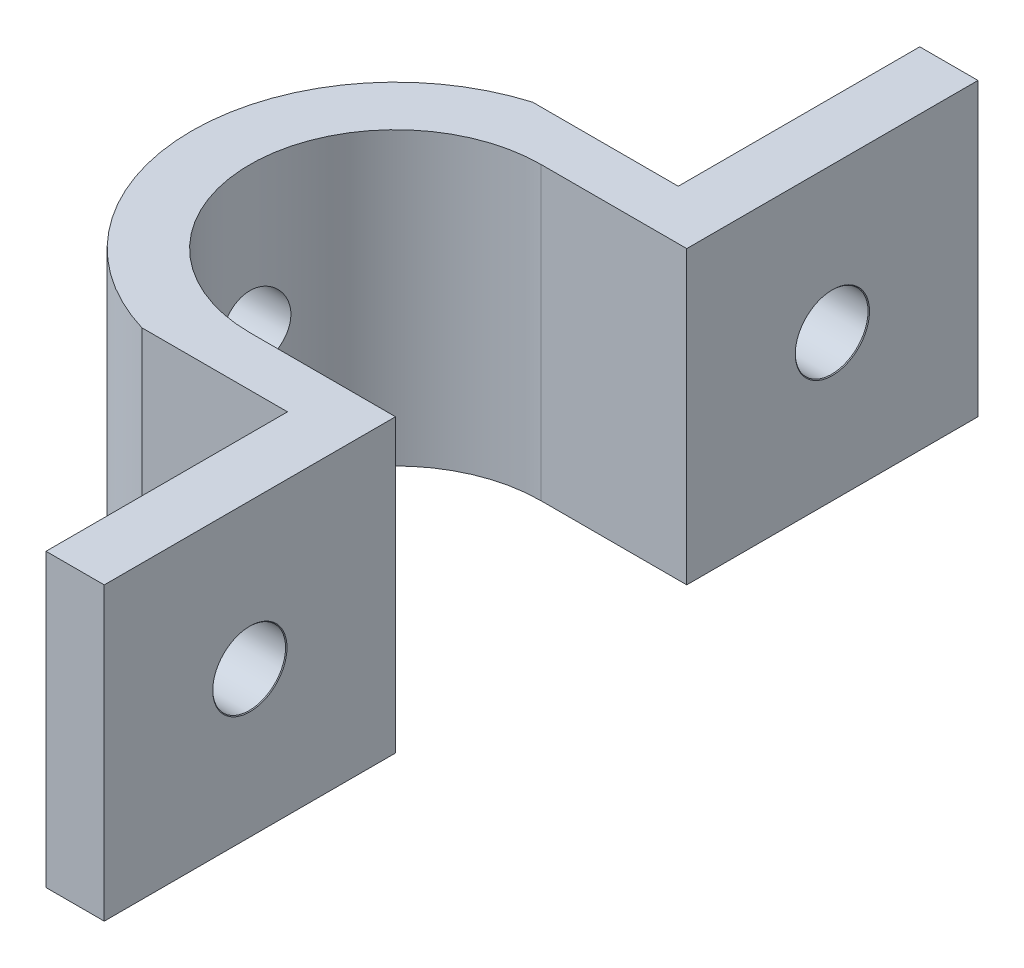
ISO-10303-21;
HEADER;
FILE_DESCRIPTION(('STEP AP214'),'2;1');
FILE_NAME('part.step','',(''),(''),'','','');
FILE_SCHEMA(('AUTOMOTIVE_DESIGN { 1 0 10303 214 1 1 1 1 }'));
ENDSEC;
DATA;
#1=APPLICATION_CONTEXT('core data for automotive mechanical design processes');
#2=APPLICATION_PROTOCOL_DEFINITION('international standard','automotive_design',2000,#1);
#3=PRODUCT_CONTEXT('',#1,'mechanical');
#4=PRODUCT('Part','Part','',(#3));
#5=PRODUCT_RELATED_PRODUCT_CATEGORY('part','',(#4));
#6=PRODUCT_DEFINITION_FORMATION('','',#4);
#7=PRODUCT_DEFINITION_CONTEXT('part definition',#1,'design');
#8=PRODUCT_DEFINITION('design','',#6,#7);
#9=PRODUCT_DEFINITION_SHAPE('','',#8);
#10=(LENGTH_UNIT() NAMED_UNIT(*) SI_UNIT(.MILLI.,.METRE.));
#11=(NAMED_UNIT(*) PLANE_ANGLE_UNIT() SI_UNIT($,.RADIAN.));
#12=(NAMED_UNIT(*) SI_UNIT($,.STERADIAN.) SOLID_ANGLE_UNIT());
#13=UNCERTAINTY_MEASURE_WITH_UNIT(LENGTH_MEASURE(1.E-05),#10,'distance_accuracy_value','');
#14=(GEOMETRIC_REPRESENTATION_CONTEXT(3) GLOBAL_UNCERTAINTY_ASSIGNED_CONTEXT((#13)) GLOBAL_UNIT_ASSIGNED_CONTEXT((#10,
#11,#12)) REPRESENTATION_CONTEXT('',''));
#15=CARTESIAN_POINT('',(0.,0.,0.));
#16=DIRECTION('',(0.,0.,1.));
#17=DIRECTION('',(1.,0.,0.));
#18=AXIS2_PLACEMENT_3D('',#15,#16,#17);
#19=CARTESIAN_POINT('',(-2.,10.,0.));
#20=DIRECTION('',(0.,0.,1.));
#21=DIRECTION('',(1.,0.,0.));
#22=AXIS2_PLACEMENT_3D('',#19,#20,#21);
#23=PLANE('',#22);
#24=DIRECTION('',(0.,-1.,0.));
#25=VECTOR('',#24,1.);
#26=CARTESIAN_POINT('',(3.,10.,0.));
#27=LINE('',#26,#25);
#28=CARTESIAN_POINT('',(3.,10.,0.));
#29=VERTEX_POINT('',#28);
#30=CARTESIAN_POINT('',(3.,0.,0.));
#31=VERTEX_POINT('',#30);
#32=EDGE_CURVE('E69',#29,#31,#27,.T.);
#33=ORIENTED_EDGE('',*,*,#32,.F.);
#34=DIRECTION('',(-1.,0.,0.));
#35=VECTOR('',#34,1.);
#36=CARTESIAN_POINT('',(-2.,10.,0.));
#37=LINE('',#36,#35);
#38=CARTESIAN_POINT('',(5.,10.,0.));
#39=VERTEX_POINT('',#38);
#40=EDGE_CURVE('E242',#39,#29,#37,.T.);
#41=ORIENTED_EDGE('',*,*,#40,.F.);
#42=DIRECTION('',(0.,1.,0.));
#43=VECTOR('',#42,1.);
#44=CARTESIAN_POINT('',(5.,0.,0.));
#45=LINE('',#44,#43);
#46=CARTESIAN_POINT('',(5.,0.,0.));
#47=VERTEX_POINT('',#46);
#48=EDGE_CURVE('E204',#47,#39,#45,.T.);
#49=ORIENTED_EDGE('',*,*,#48,.F.);
#50=DIRECTION('',(-1.,0.,0.));
#51=VECTOR('',#50,1.);
#52=CARTESIAN_POINT('',(-2.,0.,0.));
#53=LINE('',#52,#51);
#54=EDGE_CURVE('E241',#47,#31,#53,.T.);
#55=ORIENTED_EDGE('',*,*,#54,.T.);
#56=EDGE_LOOP('',(#33,#41,#49,#55));
#57=FACE_BOUND('',#56,.T.);
#58=ADVANCED_FACE('F45',(#57),#23,.F.);
#59=CARTESIAN_POINT('',(-2.,10.,30.));
#60=DIRECTION('',(0.,0.,-1.));
#61=DIRECTION('',(-1.,0.,0.));
#62=AXIS2_PLACEMENT_3D('',#59,#60,#61);
#63=PLANE('',#62);
#64=DIRECTION('',(0.,1.,0.));
#65=VECTOR('',#64,1.);
#66=CARTESIAN_POINT('',(3.,0.,30.));
#67=LINE('',#66,#65);
#68=CARTESIAN_POINT('',(3.,0.,30.));
#69=VERTEX_POINT('',#68);
#70=CARTESIAN_POINT('',(3.,10.,30.));
#71=VERTEX_POINT('',#70);
#72=EDGE_CURVE('E179',#69,#71,#67,.T.);
#73=ORIENTED_EDGE('',*,*,#72,.F.);
#74=DIRECTION('',(1.,0.,0.));
#75=VECTOR('',#74,1.);
#76=CARTESIAN_POINT('',(-2.,0.,30.));
#77=LINE('',#76,#75);
#78=CARTESIAN_POINT('',(5.,0.,30.));
#79=VERTEX_POINT('',#78);
#80=EDGE_CURVE('E305',#69,#79,#77,.T.);
#81=ORIENTED_EDGE('',*,*,#80,.T.);
#82=DIRECTION('',(0.,-1.,0.));
#83=VECTOR('',#82,1.);
#84=CARTESIAN_POINT('',(5.,10.,30.));
#85=LINE('',#84,#83);
#86=CARTESIAN_POINT('',(5.,10.,30.));
#87=VERTEX_POINT('',#86);
#88=EDGE_CURVE('E201',#87,#79,#85,.T.);
#89=ORIENTED_EDGE('',*,*,#88,.F.);
#90=DIRECTION('',(1.,0.,0.));
#91=VECTOR('',#90,1.);
#92=CARTESIAN_POINT('',(-2.,10.,30.));
#93=LINE('',#92,#91);
#94=EDGE_CURVE('E310',#71,#87,#93,.T.);
#95=ORIENTED_EDGE('',*,*,#94,.F.);
#96=EDGE_LOOP('',(#73,#81,#89,#95));
#97=FACE_BOUND('',#96,.T.);
#98=ADVANCED_FACE('F281',(#97),#63,.F.);
#99=CARTESIAN_POINT('',(5.,5.,5.));
#100=DIRECTION('',(1.,0.,0.));
#101=DIRECTION('',(0.,0.,-1.));
#102=AXIS2_PLACEMENT_3D('',#99,#100,#101);
#103=CYLINDRICAL_SURFACE('',#102,1.25);
#104=CARTESIAN_POINT('',(4.975,5.,5.));
#105=DIRECTION('',(1.,0.,0.));
#106=DIRECTION('',(0.,0.,-1.));
#107=AXIS2_PLACEMENT_3D('',#104,#105,#106);
#108=CIRCLE('',#107,1.25);
#109=CARTESIAN_POINT('',(4.975,5.,3.75));
#110=VERTEX_POINT('',#109);
#111=EDGE_CURVE('E193',#110,#110,#108,.T.);
#112=ORIENTED_EDGE('',*,*,#111,.T.);
#113=EDGE_LOOP('',(#112));
#114=FACE_BOUND('',#113,.T.);
#115=CARTESIAN_POINT('',(3.,5.,5.));
#116=DIRECTION('',(-1.,0.,0.));
#117=DIRECTION('',(0.,0.,1.));
#118=AXIS2_PLACEMENT_3D('',#115,#116,#117);
#119=CIRCLE('',#118,1.25);
#120=CARTESIAN_POINT('',(3.,5.,6.25));
#121=VERTEX_POINT('',#120);
#122=EDGE_CURVE('E48',#121,#121,#119,.F.);
#123=ORIENTED_EDGE('',*,*,#122,.F.);
#124=EDGE_LOOP('',(#123));
#125=FACE_BOUND('',#124,.T.);
#126=ADVANCED_FACE('F367',(#114,#125),#103,.F.);
#127=CARTESIAN_POINT('',(5.,5.,25.));
#128=DIRECTION('',(1.,0.,0.));
#129=DIRECTION('',(0.,0.,-1.));
#130=AXIS2_PLACEMENT_3D('',#127,#128,#129);
#131=CYLINDRICAL_SURFACE('',#130,1.25);
#132=CARTESIAN_POINT('',(4.975,5.,25.));
#133=DIRECTION('',(1.,0.,0.));
#134=DIRECTION('',(0.,0.,-1.));
#135=AXIS2_PLACEMENT_3D('',#132,#133,#134);
#136=CIRCLE('',#135,1.25);
#137=CARTESIAN_POINT('',(4.975,5.,23.75));
#138=VERTEX_POINT('',#137);
#139=EDGE_CURVE('E187',#138,#138,#136,.T.);
#140=ORIENTED_EDGE('',*,*,#139,.T.);
#141=EDGE_LOOP('',(#140));
#142=FACE_BOUND('',#141,.T.);
#143=CARTESIAN_POINT('',(3.,5.,25.));
#144=DIRECTION('',(-1.,0.,0.));
#145=DIRECTION('',(0.,0.,1.));
#146=AXIS2_PLACEMENT_3D('',#143,#144,#145);
#147=CIRCLE('',#146,1.25);
#148=CARTESIAN_POINT('',(3.,5.,26.25));
#149=VERTEX_POINT('',#148);
#150=EDGE_CURVE('E169',#149,#149,#147,.F.);
#151=ORIENTED_EDGE('',*,*,#150,.F.);
#152=EDGE_LOOP('',(#151));
#153=FACE_BOUND('',#152,.T.);
#154=ADVANCED_FACE('F279',(#142,#153),#131,.F.);
#155=CARTESIAN_POINT('',(0.,10.,15.));
#156=DIRECTION('',(0.,-1.,0.));
#157=DIRECTION('',(0.,0.,-1.));
#158=AXIS2_PLACEMENT_3D('',#155,#156,#157);
#159=CYLINDRICAL_SURFACE('',#158,7.);
#160=CARTESIAN_POINT('',(-6.97229999999937,3.91892434122785,15.6221195303226));
#161=CARTESIAN_POINT('',(-6.97687639605412,3.88420588070198,15.5710574469178));
#162=CARTESIAN_POINT('',(-6.98110533232888,3.85359923867025,15.517113406158));
#163=CARTESIAN_POINT('',(-6.98850490526234,3.80152420483822,15.4048354064262));
#164=CARTESIAN_POINT('',(-6.99167414158702,3.78006789446252,15.346495762602));
#165=CARTESIAN_POINT('',(-6.99663773743826,3.74689829769351,15.2254601823596));
#166=CARTESIAN_POINT('',(-6.99839605190007,3.7354398271167,15.1626920921372));
#167=CARTESIAN_POINT('',(-7.00019163491181,3.72374211381264,15.0361616247747));
#168=CARTESIAN_POINT('',(-7.00023090586208,3.72348981774732,14.9724004910151));
#169=CARTESIAN_POINT('',(-6.99863124457495,3.73390516177893,14.8490835748172));
#170=CARTESIAN_POINT('',(-6.99707741974184,3.7440190063447,14.789478645413));
#171=CARTESIAN_POINT('',(-6.99259095580827,3.77389785386872,14.6727679318674));
#172=CARTESIAN_POINT('',(-6.98965803561454,3.79366482440105,14.6156626598122));
#173=CARTESIAN_POINT('',(-6.98418284327265,3.83186588122514,14.5285937786767));
#174=CARTESIAN_POINT('',(-6.9819924402599,3.84738338977876,14.4972897296407));
#175=CARTESIAN_POINT('',(-6.97733531029987,3.88115078246926,14.4363291160139));
#176=CARTESIAN_POINT('',(-6.97486938784893,3.89939276128835,14.4066681145229));
#177=CARTESIAN_POINT('',(-6.97229999999937,3.91892434122785,14.3778804696774));
#178=B_SPLINE_CURVE_WITH_KNOTS('',3,(#160,#161,#162,#163,#164,#165,#166,#167,#168,#169,#170,
#171,#172,#173,#174,#175,#176,#177),.UNSPECIFIED.,.F.,.F.,(4,2,2,2,2,2,2,2,4),(0.,
0.18562372975832,0.371491790300771,0.561969246877406,0.752224822926143,0.932820412800982,
1.11345282842634,1.21834398914811,1.32293650730462),.UNSPECIFIED.);
#179=CARTESIAN_POINT('',(-6.975,3.89858046140447,15.5910795208769));
#180=VERTEX_POINT('',#179);
#181=CARTESIAN_POINT('',(-6.975,3.89858046140447,14.4089204791231));
#182=VERTEX_POINT('',#181);
#183=EDGE_CURVE('E284',#180,#182,#178,.T.);
#184=ORIENTED_EDGE('',*,*,#183,.T.);
#185=CARTESIAN_POINT('',(-6.975,3.89858046140447,14.4089204791231));
#186=CARTESIAN_POINT('',(-6.97236541565028,3.91527006188368,14.3778219145506));
#187=CARTESIAN_POINT('',(-6.96958170450395,3.93326312269034,14.3474556824941));
#188=CARTESIAN_POINT('',(-6.96379631112285,3.97173737248653,14.2883679819166));
#189=CARTESIAN_POINT('',(-6.9607946464257,3.9922183613739,14.2596463813922));
#190=CARTESIAN_POINT('',(-6.95159076338236,4.05716072231249,14.1762866229419));
#191=CARTESIAN_POINT('',(-6.94518208613423,4.10516733698902,14.1243683215844));
#192=CARTESIAN_POINT('',(-6.93254219757615,4.20923742935564,14.0293465666616));
#193=CARTESIAN_POINT('',(-6.92631105176704,4.26530383576632,13.9862463312098));
#194=CARTESIAN_POINT('',(-6.9147331924271,4.3839534895241,13.9100678013865));
#195=CARTESIAN_POINT('',(-6.90938626536948,4.4465351575583,13.8769870858281));
#196=CARTESIAN_POINT('',(-6.9002042297205,4.5763314411943,13.8218805108196));
#197=CARTESIAN_POINT('',(-6.89636580198473,4.6435354986665,13.7998303513561));
#198=CARTESIAN_POINT('',(-6.8906355704416,4.78078504233771,13.7673537574584));
#199=CARTESIAN_POINT('',(-6.88874384275038,4.85083063952987,13.7569277775293));
#200=CARTESIAN_POINT('',(-6.88714512380058,4.99068329113574,13.7481006431253));
#201=CARTESIAN_POINT('',(-6.8874070355749,5.06047923165605,13.7495283333129));
#202=CARTESIAN_POINT('',(-6.89001051175369,5.19881645474554,13.7639548766504));
#203=CARTESIAN_POINT('',(-6.89235183888011,5.26735787955437,13.7769524095885));
#204=CARTESIAN_POINT('',(-6.89882784787453,5.40095132899569,13.8140305946739));
#205=CARTESIAN_POINT('',(-6.90295456090006,5.46601743211838,13.8380620272786));
#206=CARTESIAN_POINT('',(-6.91253578457572,5.59123064166085,13.8964961812137));
#207=CARTESIAN_POINT('',(-6.91799074839821,5.65137605986565,13.9309024431835));
#208=CARTESIAN_POINT('',(-6.92970055312247,5.76585895015067,14.0096204835079));
#209=CARTESIAN_POINT('',(-6.93596487741836,5.82011067725871,14.0540553131459));
#210=CARTESIAN_POINT('',(-6.94853583177335,5.9203949697523,14.1513304896578));
#211=CARTESIAN_POINT('',(-6.954842402745,5.96643722110785,14.2041607899855));
#212=CARTESIAN_POINT('',(-6.96333101192065,6.0250725780282,14.2840467339144));
#213=CARTESIAN_POINT('',(-6.96578387017053,6.04157833485036,14.3082809175621));
#214=CARTESIAN_POINT('',(-6.97052497436363,6.07282565042634,14.3578166139113));
#215=CARTESIAN_POINT('',(-6.97281350185597,6.08757025679989,14.3831161772616));
#216=CARTESIAN_POINT('',(-6.97500000000003,6.10141953859561,14.4089204791231));
#217=B_SPLINE_CURVE_WITH_KNOTS('',3,(#185,#186,#187,#188,#189,#190,#191,#192,#193,#194,#195,
#196,#197,#198,#199,#200,#201,#202,#203,#204,#205,#206,#207,#208,#209,#210,#211,#212,#213,#214,
#215,#216),.UNSPECIFIED.,.F.,.F.,(4,2,2,2,2,2,2,2,2,2,2,2,2,2,2,4),(0.,0.106109807158893,
0.212211085630422,0.42412624243252,0.636118599307292,0.848059687919371,1.05953179704152,
1.27101217442681,1.47944435228788,1.68785274941299,1.89534038657755,2.10289891377141,
2.31315787237483,2.52316709079892,2.61137896021224,2.69943589938863),.UNSPECIFIED.);
#218=CARTESIAN_POINT('',(-6.975,6.10141953859553,14.4089204791231));
#219=VERTEX_POINT('',#218);
#220=EDGE_CURVE('E11',#182,#219,#217,.T.);
#221=ORIENTED_EDGE('',*,*,#220,.T.);
#222=CARTESIAN_POINT('',(-6.97229999999939,6.08107565877231,14.3778804696777));
#223=CARTESIAN_POINT('',(-6.97687639605414,6.11579411929816,14.4289425530824));
#224=CARTESIAN_POINT('',(-6.9811053323289,6.14640076132988,14.4828865938423));
#225=CARTESIAN_POINT('',(-6.98850490526236,6.19847579516189,14.595164593574));
#226=CARTESIAN_POINT('',(-6.99167414158704,6.21993210553757,14.6535042373983));
#227=CARTESIAN_POINT('',(-6.99663773743827,6.25310170230655,14.7745398176407));
#228=CARTESIAN_POINT('',(-6.99839605190007,6.26456017288334,14.837307907863));
#229=CARTESIAN_POINT('',(-7.00019163491181,6.27625788618737,14.9638383752256));
#230=CARTESIAN_POINT('',(-7.00023090586208,6.27651018225267,15.0275995089851));
#231=CARTESIAN_POINT('',(-6.99863124457495,6.26609483822103,15.1509164251831));
#232=CARTESIAN_POINT('',(-6.99707741974184,6.25598099365525,15.2105213545873));
#233=CARTESIAN_POINT('',(-6.99259095580825,6.2261021461312,15.3272320681328));
#234=CARTESIAN_POINT('',(-6.98965803561453,6.20633517559886,15.3843373401881));
#235=CARTESIAN_POINT('',(-6.98418284327264,6.16813411877478,15.4714062213234));
#236=CARTESIAN_POINT('',(-6.9819924402599,6.1526166102212,15.5027102703593));
#237=CARTESIAN_POINT('',(-6.97733531029988,6.11884921753079,15.563670883986));
#238=CARTESIAN_POINT('',(-6.97486938784895,6.10060723871175,15.593331885477));
#239=CARTESIAN_POINT('',(-6.97229999999939,6.08107565877231,15.6221195303223));
#240=B_SPLINE_CURVE_WITH_KNOTS('',3,(#222,#223,#224,#225,#226,#227,#228,#229,#230,#231,#232,
#233,#234,#235,#236,#237,#238,#239),.UNSPECIFIED.,.F.,.F.,(4,2,2,2,2,2,2,2,4),(0.,
0.185623729758325,0.371491790300776,0.561969246877405,0.752224822926132,0.932820412800968,
1.11345282842633,1.21834398914782,1.32293650730406),.UNSPECIFIED.);
#241=CARTESIAN_POINT('',(-6.975,6.10141953859553,15.5910795208769));
#242=VERTEX_POINT('',#241);
#243=EDGE_CURVE('E53',#219,#242,#240,.T.);
#244=ORIENTED_EDGE('',*,*,#243,.T.);
#245=CARTESIAN_POINT('',(-6.975,6.10141953859553,15.5910795208769));
#246=CARTESIAN_POINT('',(-6.97236541565027,6.08472993811631,15.6221780854494));
#247=CARTESIAN_POINT('',(-6.96958170450395,6.06673687730966,15.6525443175059));
#248=CARTESIAN_POINT('',(-6.96379631112285,6.02826262751347,15.7116320180834));
#249=CARTESIAN_POINT('',(-6.9607946464257,6.00778163862609,15.7403536186078));
#250=CARTESIAN_POINT('',(-6.95159076338236,5.94283927768751,15.8237133770581));
#251=CARTESIAN_POINT('',(-6.94518208613423,5.89483266301097,15.8756316784156));
#252=CARTESIAN_POINT('',(-6.93254219757615,5.79076257064435,15.9706534333384));
#253=CARTESIAN_POINT('',(-6.92631105176704,5.73469616423367,16.0137536687902));
#254=CARTESIAN_POINT('',(-6.9147331924271,5.61604651047589,16.0899321986135));
#255=CARTESIAN_POINT('',(-6.90938626536948,5.5534648424417,16.1230129141719));
#256=CARTESIAN_POINT('',(-6.9002042297205,5.42366855880569,16.1781194891804));
#257=CARTESIAN_POINT('',(-6.89636580198473,5.35646450133349,16.2001696486439));
#258=CARTESIAN_POINT('',(-6.8906355704416,5.21921495766228,16.2326462425416));
#259=CARTESIAN_POINT('',(-6.88874384275038,5.14916936047012,16.2430722224707));
#260=CARTESIAN_POINT('',(-6.88714512380058,5.00931670886425,16.2518993568747));
#261=CARTESIAN_POINT('',(-6.8874070355749,4.93952076834395,16.2504716666871));
#262=CARTESIAN_POINT('',(-6.89001051175369,4.80118354525445,16.2360451233496));
#263=CARTESIAN_POINT('',(-6.89235183888011,4.73264212044562,16.2230475904115));
#264=CARTESIAN_POINT('',(-6.89882784787453,4.5990486710043,16.1859694053261));
#265=CARTESIAN_POINT('',(-6.90295456090006,4.53398256788161,16.1619379727214));
#266=CARTESIAN_POINT('',(-6.91253578457572,4.40876935833915,16.1035038187863));
#267=CARTESIAN_POINT('',(-6.91799074839821,4.34862394013434,16.0690975568165));
#268=CARTESIAN_POINT('',(-6.92970055312247,4.23414104984933,15.9903795164921));
#269=CARTESIAN_POINT('',(-6.93596487741836,4.17988932274129,15.9459446868541));
#270=CARTESIAN_POINT('',(-6.94853583177335,4.07960503024769,15.8486695103422));
#271=CARTESIAN_POINT('',(-6.954842402745,4.03356277889214,15.7958392100145));
#272=CARTESIAN_POINT('',(-6.96333101192065,3.9749274219718,15.7159532660856));
#273=CARTESIAN_POINT('',(-6.96578387017053,3.95842166514964,15.6917190824379));
#274=CARTESIAN_POINT('',(-6.97052497436363,3.92717434957366,15.6421833860887));
#275=CARTESIAN_POINT('',(-6.97281350185597,3.91242974320011,15.6168838227384));
#276=CARTESIAN_POINT('',(-6.97500000000003,3.89858046140439,15.5910795208769));
#277=B_SPLINE_CURVE_WITH_KNOTS('',3,(#245,#246,#247,#248,#249,#250,#251,#252,#253,#254,#255,
#256,#257,#258,#259,#260,#261,#262,#263,#264,#265,#266,#267,#268,#269,#270,#271,#272,#273,#274,
#275,#276),.UNSPECIFIED.,.F.,.F.,(4,2,2,2,2,2,2,2,2,2,2,2,2,2,2,4),(0.,0.106109807158896,
0.212211085630428,0.424126242432524,0.636118599307296,0.848059687919377,1.05953179704153,
1.27101217442682,1.47944435228788,1.68785274941299,1.89534038657756,2.10289891377142,
2.31315787237483,2.52316709079893,2.61137896021225,2.69943589938863),.UNSPECIFIED.);
#278=EDGE_CURVE('E261',#242,#180,#277,.T.);
#279=ORIENTED_EDGE('',*,*,#278,.T.);
#280=EDGE_LOOP('',(#184,#221,#244,#279));
#281=FACE_BOUND('',#280,.T.);
#282=CARTESIAN_POINT('',(0.,0.,15.));
#283=DIRECTION('',(0.,1.,0.));
#284=DIRECTION('',(0.,0.,1.));
#285=AXIS2_PLACEMENT_3D('',#282,#283,#284);
#286=CIRCLE('',#285,7.);
#287=CARTESIAN_POINT('',(-2.,0.,8.29179606750063));
#288=VERTEX_POINT('',#287);
#289=CARTESIAN_POINT('',(-2.,0.,21.7082039324994));
#290=VERTEX_POINT('',#289);
#291=EDGE_CURVE('E167',#288,#290,#286,.T.);
#292=ORIENTED_EDGE('',*,*,#291,.T.);
#293=DIRECTION('',(0.,-1.,0.));
#294=VECTOR('',#293,1.);
#295=CARTESIAN_POINT('',(-2.,10.,21.7082039324994));
#296=LINE('',#295,#294);
#297=CARTESIAN_POINT('',(-2.,10.,21.7082039324994));
#298=VERTEX_POINT('',#297);
#299=EDGE_CURVE('E294',#298,#290,#296,.T.);
#300=ORIENTED_EDGE('',*,*,#299,.F.);
#301=CARTESIAN_POINT('',(0.,10.,15.));
#302=DIRECTION('',(0.,1.,0.));
#303=DIRECTION('',(0.,0.,1.));
#304=AXIS2_PLACEMENT_3D('',#301,#302,#303);
#305=CIRCLE('',#304,7.);
#306=CARTESIAN_POINT('',(-2.,10.,8.29179606750063));
#307=VERTEX_POINT('',#306);
#308=EDGE_CURVE('E311',#307,#298,#305,.T.);
#309=ORIENTED_EDGE('',*,*,#308,.F.);
#310=DIRECTION('',(0.,-1.,0.));
#311=VECTOR('',#310,1.);
#312=CARTESIAN_POINT('',(-2.,10.,8.29179606750063));
#313=LINE('',#312,#311);
#314=EDGE_CURVE('E292',#307,#288,#313,.T.);
#315=ORIENTED_EDGE('',*,*,#314,.T.);
#316=EDGE_LOOP('',(#292,#300,#309,#315));
#317=FACE_BOUND('',#316,.T.);
#318=ADVANCED_FACE('F276',(#281,#317),#159,.T.);
#319=CARTESIAN_POINT('',(0.,10.,15.));
#320=DIRECTION('',(0.,-1.,0.));
#321=DIRECTION('',(0.,0.,-1.));
#322=AXIS2_PLACEMENT_3D('',#319,#320,#321);
#323=CYLINDRICAL_SURFACE('',#322,5.);
#324=CARTESIAN_POINT('',(-4.84122918275927,5.,16.25));
#325=CARTESIAN_POINT('',(-4.84123050042654,5.0690253754623,16.2499980392959));
#326=CARTESIAN_POINT('',(-4.84272153006957,5.138072449339,16.2442631227486));
#327=CARTESIAN_POINT('',(-4.84850930996624,5.27418378908702,16.2215115627321));
#328=CARTESIAN_POINT('',(-4.85280769310907,5.34124687723416,16.2044883533711));
#329=CARTESIAN_POINT('',(-4.86369362297984,5.47140176909352,16.159745599816));
#330=CARTESIAN_POINT('',(-4.87027821345205,5.53449857769284,16.1320398639272));
#331=CARTESIAN_POINT('',(-4.88499096014404,5.65515542626996,16.0667605706307));
#332=CARTESIAN_POINT('',(-4.89311918189251,5.71271523104011,16.0291865942803));
#333=CARTESIAN_POINT('',(-4.91020358177806,5.8219308226311,15.9443542136559));
#334=CARTESIAN_POINT('',(-4.91917298811515,5.87344680017502,15.896918443852));
#335=CARTESIAN_POINT('',(-4.93681437757649,5.96788069718017,15.7940910320503));
#336=CARTESIAN_POINT('',(-4.94548633283195,6.01079781281087,15.7386986470902));
#337=CARTESIAN_POINT('',(-4.96170207760291,6.08738773381564,15.6205726005395));
#338=CARTESIAN_POINT('',(-4.96922843700296,6.12092319408073,15.5577472880976));
#339=CARTESIAN_POINT('',(-4.98215405962992,6.17690482207654,15.4271315921464));
#340=CARTESIAN_POINT('',(-4.98755363667172,6.19935262595776,15.359341942896));
#341=CARTESIAN_POINT('',(-4.9955237942409,6.23207391728929,15.2221793793771));
#342=CARTESIAN_POINT('',(-4.99814946922157,6.24258482216329,15.1528663597745));
#343=CARTESIAN_POINT('',(-5.00046797053649,6.25187918963778,15.0134144096314));
#344=CARTESIAN_POINT('',(-5.00016123048352,6.2506643861048,14.943275602731));
#345=CARTESIAN_POINT('',(-4.99669047476768,6.23671257487493,14.8058096910345));
#346=CARTESIAN_POINT('',(-4.99359001170437,6.22423183747307,14.7384547304987));
#347=CARTESIAN_POINT('',(-4.98495418262427,6.18851436497575,14.6068271907329));
#348=CARTESIAN_POINT('',(-4.97941868699221,6.16527705731129,14.542554775787));
#349=CARTESIAN_POINT('',(-4.96643754850448,6.10849871465647,14.4182416206227));
#350=CARTESIAN_POINT('',(-4.95897509847527,6.07486647766913,14.3582443627919));
#351=CARTESIAN_POINT('',(-4.94294951904825,5.99832216044187,14.2446554720744));
#352=CARTESIAN_POINT('',(-4.93438619826245,5.95540846571969,14.1910649561431));
#353=CARTESIAN_POINT('',(-4.9168185688476,5.86014562900881,14.0902824561438));
#354=CARTESIAN_POINT('',(-4.90780859762959,5.80757255382611,14.043302901156));
#355=CARTESIAN_POINT('',(-4.89057521758353,5.69520001322987,13.9587795300462));
#356=CARTESIAN_POINT('',(-4.88235184552985,5.6354002102545,13.9212361549425));
#357=CARTESIAN_POINT('',(-4.86760248415824,5.50985498292552,13.8565148387218));
#358=CARTESIAN_POINT('',(-4.86108491862861,5.4440821348434,13.8293880412869));
#359=CARTESIAN_POINT('',(-4.85059320069979,5.30870726596177,13.7866429742046));
#360=CARTESIAN_POINT('',(-4.84661850405109,5.23910606800843,13.7710222418089));
#361=CARTESIAN_POINT('',(-4.8417767801957,5.10002024923844,13.7520851806674));
#362=CARTESIAN_POINT('',(-4.84083044546824,5.03058110333518,13.7484547630402));
#363=CARTESIAN_POINT('',(-4.8419367174052,4.89208903171092,13.7527415047422));
#364=CARTESIAN_POINT('',(-4.84398904800633,4.82303607102438,13.7606576010756));
#365=CARTESIAN_POINT('',(-4.8507854097728,4.68844286752265,13.7875372680312));
#366=CARTESIAN_POINT('',(-4.85548485117188,4.62286363671458,13.8063179658591));
#367=CARTESIAN_POINT('',(-4.86700359135481,4.49578427107416,13.8541909591647));
#368=CARTESIAN_POINT('',(-4.87382314124307,4.43428462047233,13.8832844761437));
#369=CARTESIAN_POINT('',(-4.88898068546631,4.31577936106633,13.9516146660317));
#370=CARTESIAN_POINT('',(-4.89734584303321,4.25888557997845,13.9910391230822));
#371=CARTESIAN_POINT('',(-4.91458541535858,4.15240581859932,14.0786746338319));
#372=CARTESIAN_POINT('',(-4.92345991364235,4.10282104167496,14.1268871314932));
#373=CARTESIAN_POINT('',(-4.94098701515803,4.01109447871452,14.2321715987691));
#374=CARTESIAN_POINT('',(-4.94962851030918,3.9691699687256,14.2894350593355));
#375=CARTESIAN_POINT('',(-4.96548608306867,3.89553206652438,14.4103716466317));
#376=CARTESIAN_POINT('',(-4.9727022350198,3.8638181416959,14.474044438803));
#377=CARTESIAN_POINT('',(-4.98485057869157,3.81177698273604,14.6055522478361));
#378=CARTESIAN_POINT('',(-4.98979915011205,3.79136785781047,14.6733532737151));
#379=CARTESIAN_POINT('',(-4.99692646697894,3.76226983269579,14.8115627996015));
#380=CARTESIAN_POINT('',(-4.99910574696704,3.75357867063048,14.8819707936984));
#381=CARTESIAN_POINT('',(-5.00042711761014,3.74829051303058,15.0213544080542));
#382=CARTESIAN_POINT('',(-4.99964973600011,3.75137286363076,15.0903172837075));
#383=CARTESIAN_POINT('',(-4.9953237057178,3.76880978411792,15.2267093705184));
#384=CARTESIAN_POINT('',(-4.99177513946369,3.78316401876638,15.2941386272261));
#385=CARTESIAN_POINT('',(-4.98231791067453,3.82256527471366,15.425213794556));
#386=CARTESIAN_POINT('',(-4.97642205628333,3.84755431664328,15.4888781182263));
#387=CARTESIAN_POINT('',(-4.9628911114173,3.90746322377416,15.6111463163018));
#388=CARTESIAN_POINT('',(-4.9552558017217,3.94238434083696,15.6697495515813));
#389=CARTESIAN_POINT('',(-4.93884062101666,4.02214404249634,15.7817524105299));
#390=CARTESIAN_POINT('',(-4.93003771182014,4.06720017863422,15.8349937353757));
#391=CARTESIAN_POINT('',(-4.91238311316553,4.16552856496725,15.9332687753391));
#392=CARTESIAN_POINT('',(-4.90353141190695,4.21880289512238,15.9783004063352));
#393=CARTESIAN_POINT('',(-4.88659344825685,4.33325176775167,16.059702533099));
#394=CARTESIAN_POINT('',(-4.87852454662356,4.39455515426578,16.0958957743082));
#395=CARTESIAN_POINT('',(-4.8642994443827,4.52256936240338,16.1574086207696));
#396=CARTESIAN_POINT('',(-4.85814185308379,4.58927620763343,16.1827361371996));
#397=CARTESIAN_POINT('',(-4.84939885924729,4.7132212647834,16.2180281607068));
#398=CARTESIAN_POINT('',(-4.84635828750684,4.76986645547983,16.2299914632442));
#399=CARTESIAN_POINT('',(-4.84227298231965,4.88433608624995,16.2459778657166));
#400=CARTESIAN_POINT('',(-4.84122807862454,4.94216042530633,16.2500016429652));
#401=CARTESIAN_POINT('',(-4.84122918275927,5.,16.25));
#402=B_SPLINE_CURVE_WITH_KNOTS('',3,(#324,#325,#326,#327,#328,#329,#330,#331,#332,#333,#334,
#335,#336,#337,#338,#339,#340,#341,#342,#343,#344,#345,#346,#347,#348,#349,#350,#351,#352,#353,
#354,#355,#356,#357,#358,#359,#360,#361,#362,#363,#364,#365,#366,#367,#368,#369,#370,#371,#372,
#373,#374,#375,#376,#377,#378,#379,#380,#381,#382,#383,#384,#385,#386,#387,#388,#389,#390,#391,
#392,#393,#394,#395,#396,#397,#398,#399,#400,#401),.UNSPECIFIED.,.T.,.F.,(4,2,2,2,2,2,2,2,2,2,2,
2,2,2,2,2,2,2,2,2,2,2,2,2,2,2,2,2,2,2,2,2,2,2,2,2,2,2,4),(0.,0.206863720868068,
0.413847870714333,0.620565363583012,0.827291633777392,1.03811977096488,1.24896760739933,
1.4627574819896,1.67651579923546,1.88594375497673,2.0953407433301,2.30009131344473,
2.50485278362393,2.71146437127222,2.91811192734456,3.13035233285956,3.34260265599901,
3.55588216004201,3.76911600064774,3.97671787380858,4.18430063591901,4.38848702504603,
4.59269760710708,4.80091422929578,5.00916509442522,5.22262665482659,5.43607707859776,
5.64796036403464,5.85980274454519,6.06591723063728,6.2720255868849,6.47702438279855,
6.68204902869036,6.89198548291035,7.10197515782754,7.31588238642338,7.52963360683309,
7.70298913588664,7.8763298754976),.UNSPECIFIED.);
#403=CARTESIAN_POINT('',(-4.84122918275927,5.,16.25));
#404=VERTEX_POINT('',#403);
#405=EDGE_CURVE('E233',#404,#404,#402,.T.);
#406=ORIENTED_EDGE('',*,*,#405,.T.);
#407=EDGE_LOOP('',(#406));
#408=FACE_BOUND('',#407,.T.);
#409=CARTESIAN_POINT('',(0.,0.,15.));
#410=DIRECTION('',(0.,-1.,0.));
#411=DIRECTION('',(0.,0.,1.));
#412=AXIS2_PLACEMENT_3D('',#409,#410,#411);
#413=CIRCLE('',#412,5.);
#414=CARTESIAN_POINT('',(0.,0.,20.));
#415=VERTEX_POINT('',#414);
#416=CARTESIAN_POINT('',(0.,0.,10.));
#417=VERTEX_POINT('',#416);
#418=EDGE_CURVE('E303',#415,#417,#413,.T.);
#419=ORIENTED_EDGE('',*,*,#418,.T.);
#420=DIRECTION('',(0.,-1.,0.));
#421=VECTOR('',#420,1.);
#422=CARTESIAN_POINT('',(0.,10.,10.));
#423=LINE('',#422,#421);
#424=CARTESIAN_POINT('',(0.,10.,10.));
#425=VERTEX_POINT('',#424);
#426=EDGE_CURVE('E299',#425,#417,#423,.T.);
#427=ORIENTED_EDGE('',*,*,#426,.F.);
#428=CARTESIAN_POINT('',(0.,10.,15.));
#429=DIRECTION('',(0.,-1.,0.));
#430=DIRECTION('',(0.,0.,1.));
#431=AXIS2_PLACEMENT_3D('',#428,#429,#430);
#432=CIRCLE('',#431,5.);
#433=CARTESIAN_POINT('',(0.,10.,20.));
#434=VERTEX_POINT('',#433);
#435=EDGE_CURVE('E302',#434,#425,#432,.T.);
#436=ORIENTED_EDGE('',*,*,#435,.F.);
#437=DIRECTION('',(0.,-1.,0.));
#438=VECTOR('',#437,1.);
#439=CARTESIAN_POINT('',(0.,10.,20.));
#440=LINE('',#439,#438);
#441=EDGE_CURVE('E296',#434,#415,#440,.T.);
#442=ORIENTED_EDGE('',*,*,#441,.T.);
#443=EDGE_LOOP('',(#419,#427,#436,#442));
#444=FACE_BOUND('',#443,.T.);
#445=ADVANCED_FACE('F244',(#408,#444),#323,.F.);
#446=CARTESIAN_POINT('',(0.,10.,15.));
#447=DIRECTION('',(0.,1.,0.));
#448=DIRECTION('',(0.,0.,1.));
#449=AXIS2_PLACEMENT_3D('',#446,#447,#448);
#450=PLANE('',#449);
#451=DIRECTION('',(-1.,0.,0.));
#452=VECTOR('',#451,1.);
#453=CARTESIAN_POINT('',(3.,10.,8.29179606750063));
#454=LINE('',#453,#452);
#455=CARTESIAN_POINT('',(3.,10.,8.29179606750063));
#456=VERTEX_POINT('',#455);
#457=EDGE_CURVE('E153',#456,#307,#454,.T.);
#458=ORIENTED_EDGE('',*,*,#457,.T.);
#459=ORIENTED_EDGE('',*,*,#308,.T.);
#460=DIRECTION('',(-1.,0.,0.));
#461=VECTOR('',#460,1.);
#462=CARTESIAN_POINT('',(3.,10.,21.7082039324994));
#463=LINE('',#462,#461);
#464=CARTESIAN_POINT('',(3.,10.,21.7082039324994));
#465=VERTEX_POINT('',#464);
#466=EDGE_CURVE('E176',#465,#298,#463,.T.);
#467=ORIENTED_EDGE('',*,*,#466,.F.);
#468=DIRECTION('',(0.,0.,-1.));
#469=VECTOR('',#468,1.);
#470=CARTESIAN_POINT('',(3.,10.,30.));
#471=LINE('',#470,#469);
#472=EDGE_CURVE('E175',#71,#465,#471,.T.);
#473=ORIENTED_EDGE('',*,*,#472,.F.);
#474=ORIENTED_EDGE('',*,*,#94,.T.);
#475=DIRECTION('',(0.,0.,1.));
#476=VECTOR('',#475,1.);
#477=CARTESIAN_POINT('',(5.,10.,20.));
#478=LINE('',#477,#476);
#479=CARTESIAN_POINT('',(5.,10.,20.));
#480=VERTEX_POINT('',#479);
#481=EDGE_CURVE('E221',#480,#87,#478,.T.);
#482=ORIENTED_EDGE('',*,*,#481,.F.);
#483=DIRECTION('',(-1.,0.,0.));
#484=VECTOR('',#483,1.);
#485=CARTESIAN_POINT('',(5.,10.,20.));
#486=LINE('',#485,#484);
#487=EDGE_CURVE('E218',#480,#434,#486,.T.);
#488=ORIENTED_EDGE('',*,*,#487,.T.);
#489=ORIENTED_EDGE('',*,*,#435,.T.);
#490=DIRECTION('',(-1.,0.,0.));
#491=VECTOR('',#490,1.);
#492=CARTESIAN_POINT('',(5.,10.,10.));
#493=LINE('',#492,#491);
#494=CARTESIAN_POINT('',(5.,10.,10.));
#495=VERTEX_POINT('',#494);
#496=EDGE_CURVE('E209',#495,#425,#493,.T.);
#497=ORIENTED_EDGE('',*,*,#496,.F.);
#498=DIRECTION('',(0.,0.,1.));
#499=VECTOR('',#498,1.);
#500=CARTESIAN_POINT('',(5.,10.,0.));
#501=LINE('',#500,#499);
#502=EDGE_CURVE('E207',#39,#495,#501,.T.);
#503=ORIENTED_EDGE('',*,*,#502,.F.);
#504=ORIENTED_EDGE('',*,*,#40,.T.);
#505=DIRECTION('',(0.,0.,-1.));
#506=VECTOR('',#505,1.);
#507=CARTESIAN_POINT('',(3.,10.,8.29179606750063));
#508=LINE('',#507,#506);
#509=EDGE_CURVE('E155',#456,#29,#508,.T.);
#510=ORIENTED_EDGE('',*,*,#509,.F.);
#511=EDGE_LOOP('',(#458,#459,#467,#473,#474,#482,#488,#489,#497,#503,#504,#510));
#512=FACE_BOUND('',#511,.T.);
#513=ADVANCED_FACE('F257',(#512),#450,.T.);
#514=CARTESIAN_POINT('',(0.,0.,15.));
#515=DIRECTION('',(0.,1.,0.));
#516=DIRECTION('',(0.,0.,1.));
#517=AXIS2_PLACEMENT_3D('',#514,#515,#516);
#518=PLANE('',#517);
#519=ORIENTED_EDGE('',*,*,#291,.F.);
#520=DIRECTION('',(-1.,0.,0.));
#521=VECTOR('',#520,1.);
#522=CARTESIAN_POINT('',(3.,0.,8.29179606750063));
#523=LINE('',#522,#521);
#524=CARTESIAN_POINT('',(3.,0.,8.29179606750063));
#525=VERTEX_POINT('',#524);
#526=EDGE_CURVE('E150',#525,#288,#523,.T.);
#527=ORIENTED_EDGE('',*,*,#526,.F.);
#528=DIRECTION('',(0.,0.,1.));
#529=VECTOR('',#528,1.);
#530=CARTESIAN_POINT('',(3.,0.,0.));
#531=LINE('',#530,#529);
#532=EDGE_CURVE('E156',#31,#525,#531,.T.);
#533=ORIENTED_EDGE('',*,*,#532,.F.);
#534=ORIENTED_EDGE('',*,*,#54,.F.);
#535=DIRECTION('',(0.,0.,-1.));
#536=VECTOR('',#535,1.);
#537=CARTESIAN_POINT('',(5.,0.,10.));
#538=LINE('',#537,#536);
#539=CARTESIAN_POINT('',(5.,0.,10.));
#540=VERTEX_POINT('',#539);
#541=EDGE_CURVE('E200',#540,#47,#538,.T.);
#542=ORIENTED_EDGE('',*,*,#541,.F.);
#543=DIRECTION('',(-1.,0.,0.));
#544=VECTOR('',#543,1.);
#545=CARTESIAN_POINT('',(5.,0.,10.));
#546=LINE('',#545,#544);
#547=EDGE_CURVE('E212',#540,#417,#546,.T.);
#548=ORIENTED_EDGE('',*,*,#547,.T.);
#549=ORIENTED_EDGE('',*,*,#418,.F.);
#550=DIRECTION('',(-1.,0.,0.));
#551=VECTOR('',#550,1.);
#552=CARTESIAN_POINT('',(5.,0.,20.));
#553=LINE('',#552,#551);
#554=CARTESIAN_POINT('',(5.,0.,20.));
#555=VERTEX_POINT('',#554);
#556=EDGE_CURVE('E196',#555,#415,#553,.T.);
#557=ORIENTED_EDGE('',*,*,#556,.F.);
#558=DIRECTION('',(0.,0.,-1.));
#559=VECTOR('',#558,1.);
#560=CARTESIAN_POINT('',(5.,0.,30.));
#561=LINE('',#560,#559);
#562=EDGE_CURVE('E226',#79,#555,#561,.T.);
#563=ORIENTED_EDGE('',*,*,#562,.F.);
#564=ORIENTED_EDGE('',*,*,#80,.F.);
#565=DIRECTION('',(0.,0.,1.));
#566=VECTOR('',#565,1.);
#567=CARTESIAN_POINT('',(3.,0.,21.7082039324994));
#568=LINE('',#567,#566);
#569=CARTESIAN_POINT('',(3.,0.,21.7082039324994));
#570=VERTEX_POINT('',#569);
#571=EDGE_CURVE('E181',#570,#69,#568,.T.);
#572=ORIENTED_EDGE('',*,*,#571,.F.);
#573=DIRECTION('',(-1.,0.,0.));
#574=VECTOR('',#573,1.);
#575=CARTESIAN_POINT('',(3.,0.,21.7082039324994));
#576=LINE('',#575,#574);
#577=EDGE_CURVE('E173',#570,#290,#576,.T.);
#578=ORIENTED_EDGE('',*,*,#577,.T.);
#579=EDGE_LOOP('',(#519,#527,#533,#534,#542,#548,#549,#557,#563,#564,#572,#578));
#580=FACE_BOUND('',#579,.T.);
#581=ADVANCED_FACE('F164',(#580),#518,.F.);
#582=CARTESIAN_POINT('',(-7.,5.,15.));
#583=DIRECTION('',(-1.,0.,0.));
#584=DIRECTION('',(0.,0.,1.));
#585=AXIS2_PLACEMENT_3D('',#582,#583,#584);
#586=CYLINDRICAL_SURFACE('',#585,1.25);
#587=CARTESIAN_POINT('',(-6.975,5.,15.));
#588=DIRECTION('',(-1.,0.,0.));
#589=DIRECTION('',(0.,0.,1.));
#590=AXIS2_PLACEMENT_3D('',#587,#588,#589);
#591=CIRCLE('',#590,1.25);
#592=EDGE_CURVE('E215',#182,#180,#591,.T.);
#593=ORIENTED_EDGE('',*,*,#592,.T.);
#594=ORIENTED_EDGE('',*,*,#278,.F.);
#595=EDGE_CURVE('E230',#242,#219,#591,.T.);
#596=ORIENTED_EDGE('',*,*,#595,.T.);
#597=ORIENTED_EDGE('',*,*,#220,.F.);
#598=EDGE_LOOP('',(#593,#594,#596,#597));
#599=FACE_BOUND('',#598,.T.);
#600=ORIENTED_EDGE('',*,*,#405,.F.);
#601=EDGE_LOOP('',(#600));
#602=FACE_BOUND('',#601,.T.);
#603=ADVANCED_FACE('F248',(#599,#602),#586,.F.);
#604=CARTESIAN_POINT('',(-7.,5.,15.));
#605=DIRECTION('',(-1.,0.,0.));
#606=DIRECTION('',(0.,0.,1.));
#607=AXIS2_PLACEMENT_3D('',#604,#605,#606);
#608=CONICAL_SURFACE('',#607,1.275,0.785398163397448);
#609=ORIENTED_EDGE('',*,*,#595,.F.);
#610=ORIENTED_EDGE('',*,*,#243,.F.);
#611=EDGE_LOOP('',(#609,#610));
#612=FACE_BOUND('',#611,.T.);
#613=ADVANCED_FACE('F253',(#612),#608,.F.);
#614=ORIENTED_EDGE('',*,*,#592,.F.);
#615=ORIENTED_EDGE('',*,*,#183,.F.);
#616=EDGE_LOOP('',(#614,#615));
#617=FACE_BOUND('',#616,.T.);
#618=ADVANCED_FACE('F388',(#617),#608,.F.);
#619=CARTESIAN_POINT('',(5.,0.,20.));
#620=DIRECTION('',(0.,0.,1.));
#621=DIRECTION('',(1.,0.,0.));
#622=AXIS2_PLACEMENT_3D('',#619,#620,#621);
#623=PLANE('',#622);
#624=ORIENTED_EDGE('',*,*,#441,.F.);
#625=ORIENTED_EDGE('',*,*,#487,.F.);
#626=DIRECTION('',(0.,1.,0.));
#627=VECTOR('',#626,1.);
#628=CARTESIAN_POINT('',(5.,0.,20.));
#629=LINE('',#628,#627);
#630=EDGE_CURVE('E224',#555,#480,#629,.T.);
#631=ORIENTED_EDGE('',*,*,#630,.F.);
#632=ORIENTED_EDGE('',*,*,#556,.T.);
#633=EDGE_LOOP('',(#624,#625,#631,#632));
#634=FACE_BOUND('',#633,.T.);
#635=ADVANCED_FACE('F335',(#634),#623,.F.);
#636=CARTESIAN_POINT('',(5.,0.,0.));
#637=DIRECTION('',(1.,0.,0.));
#638=DIRECTION('',(0.,0.,-1.));
#639=AXIS2_PLACEMENT_3D('',#636,#637,#638);
#640=PLANE('',#639);
#641=CARTESIAN_POINT('',(5.,5.,25.));
#642=DIRECTION('',(1.,0.,0.));
#643=DIRECTION('',(0.,0.,-1.));
#644=AXIS2_PLACEMENT_3D('',#641,#642,#643);
#645=CIRCLE('',#644,1.275);
#646=CARTESIAN_POINT('',(5.,5.,23.725));
#647=VERTEX_POINT('',#646);
#648=EDGE_CURVE('E184',#647,#647,#645,.T.);
#649=ORIENTED_EDGE('',*,*,#648,.F.);
#650=EDGE_LOOP('',(#649));
#651=FACE_BOUND('',#650,.T.);
#652=ORIENTED_EDGE('',*,*,#88,.T.);
#653=ORIENTED_EDGE('',*,*,#562,.T.);
#654=ORIENTED_EDGE('',*,*,#630,.T.);
#655=ORIENTED_EDGE('',*,*,#481,.T.);
#656=EDGE_LOOP('',(#652,#653,#654,#655));
#657=FACE_BOUND('',#656,.T.);
#658=ADVANCED_FACE('F341',(#651,#657),#640,.T.);
#659=CARTESIAN_POINT('',(5.,10.,10.));
#660=DIRECTION('',(0.,0.,-1.));
#661=DIRECTION('',(-1.,0.,0.));
#662=AXIS2_PLACEMENT_3D('',#659,#660,#661);
#663=PLANE('',#662);
#664=ORIENTED_EDGE('',*,*,#426,.T.);
#665=ORIENTED_EDGE('',*,*,#547,.F.);
#666=DIRECTION('',(0.,-1.,0.));
#667=VECTOR('',#666,1.);
#668=CARTESIAN_POINT('',(5.,10.,10.));
#669=LINE('',#668,#667);
#670=EDGE_CURVE('E197',#495,#540,#669,.T.);
#671=ORIENTED_EDGE('',*,*,#670,.F.);
#672=ORIENTED_EDGE('',*,*,#496,.T.);
#673=EDGE_LOOP('',(#664,#665,#671,#672));
#674=FACE_BOUND('',#673,.T.);
#675=ADVANCED_FACE('F329',(#674),#663,.F.);
#676=CARTESIAN_POINT('',(5.,0.,0.));
#677=DIRECTION('',(1.,0.,0.));
#678=DIRECTION('',(0.,0.,-1.));
#679=AXIS2_PLACEMENT_3D('',#676,#677,#678);
#680=PLANE('',#679);
#681=CARTESIAN_POINT('',(5.,5.,5.));
#682=DIRECTION('',(1.,0.,0.));
#683=DIRECTION('',(0.,0.,-1.));
#684=AXIS2_PLACEMENT_3D('',#681,#682,#683);
#685=CIRCLE('',#684,1.275);
#686=CARTESIAN_POINT('',(5.,5.,3.725));
#687=VERTEX_POINT('',#686);
#688=EDGE_CURVE('E190',#687,#687,#685,.T.);
#689=ORIENTED_EDGE('',*,*,#688,.F.);
#690=EDGE_LOOP('',(#689));
#691=FACE_BOUND('',#690,.T.);
#692=ORIENTED_EDGE('',*,*,#670,.T.);
#693=ORIENTED_EDGE('',*,*,#541,.T.);
#694=ORIENTED_EDGE('',*,*,#48,.T.);
#695=ORIENTED_EDGE('',*,*,#502,.T.);
#696=EDGE_LOOP('',(#692,#693,#694,#695));
#697=FACE_BOUND('',#696,.T.);
#698=ADVANCED_FACE('F323',(#691,#697),#680,.T.);
#699=CARTESIAN_POINT('',(5.,5.,5.));
#700=DIRECTION('',(1.,0.,0.));
#701=DIRECTION('',(0.,0.,-1.));
#702=AXIS2_PLACEMENT_3D('',#699,#700,#701);
#703=CONICAL_SURFACE('',#702,1.275,0.785398163397431);
#704=ORIENTED_EDGE('',*,*,#111,.F.);
#705=EDGE_LOOP('',(#704));
#706=FACE_BOUND('',#705,.T.);
#707=ORIENTED_EDGE('',*,*,#688,.T.);
#708=EDGE_LOOP('',(#707));
#709=FACE_BOUND('',#708,.T.);
#710=ADVANCED_FACE('F381',(#706,#709),#703,.F.);
#711=CARTESIAN_POINT('',(5.,5.,25.));
#712=DIRECTION('',(1.,0.,0.));
#713=DIRECTION('',(0.,0.,-1.));
#714=AXIS2_PLACEMENT_3D('',#711,#712,#713);
#715=CONICAL_SURFACE('',#714,1.275,0.785398163397431);
#716=ORIENTED_EDGE('',*,*,#139,.F.);
#717=EDGE_LOOP('',(#716));
#718=FACE_BOUND('',#717,.T.);
#719=ORIENTED_EDGE('',*,*,#648,.T.);
#720=EDGE_LOOP('',(#719));
#721=FACE_BOUND('',#720,.T.);
#722=ADVANCED_FACE('F359',(#718,#721),#715,.F.);
#723=CARTESIAN_POINT('',(3.,0.,0.));
#724=DIRECTION('',(-1.,0.,0.));
#725=DIRECTION('',(0.,0.,1.));
#726=AXIS2_PLACEMENT_3D('',#723,#724,#725);
#727=PLANE('',#726);
#728=DIRECTION('',(0.,-1.,0.));
#729=VECTOR('',#728,1.);
#730=CARTESIAN_POINT('',(3.,10.,21.7082039324994));
#731=LINE('',#730,#729);
#732=EDGE_CURVE('E61',#465,#570,#731,.T.);
#733=ORIENTED_EDGE('',*,*,#732,.T.);
#734=ORIENTED_EDGE('',*,*,#571,.T.);
#735=ORIENTED_EDGE('',*,*,#72,.T.);
#736=ORIENTED_EDGE('',*,*,#472,.T.);
#737=EDGE_LOOP('',(#733,#734,#735,#736));
#738=FACE_BOUND('',#737,.T.);
#739=ORIENTED_EDGE('',*,*,#150,.T.);
#740=EDGE_LOOP('',(#739));
#741=FACE_BOUND('',#740,.T.);
#742=ADVANCED_FACE('F347',(#738,#741),#727,.T.);
#743=CARTESIAN_POINT('',(3.,10.,21.7082039324994));
#744=DIRECTION('',(0.,0.,-1.));
#745=DIRECTION('',(-1.,0.,0.));
#746=AXIS2_PLACEMENT_3D('',#743,#744,#745);
#747=PLANE('',#746);
#748=ORIENTED_EDGE('',*,*,#299,.T.);
#749=ORIENTED_EDGE('',*,*,#577,.F.);
#750=ORIENTED_EDGE('',*,*,#732,.F.);
#751=ORIENTED_EDGE('',*,*,#466,.T.);
#752=EDGE_LOOP('',(#748,#749,#750,#751));
#753=FACE_BOUND('',#752,.T.);
#754=ADVANCED_FACE('F350',(#753),#747,.F.);
#755=CARTESIAN_POINT('',(3.,0.,0.));
#756=DIRECTION('',(-1.,0.,0.));
#757=DIRECTION('',(0.,0.,1.));
#758=AXIS2_PLACEMENT_3D('',#755,#756,#757);
#759=PLANE('',#758);
#760=ORIENTED_EDGE('',*,*,#32,.T.);
#761=ORIENTED_EDGE('',*,*,#532,.T.);
#762=DIRECTION('',(0.,1.,0.));
#763=VECTOR('',#762,1.);
#764=CARTESIAN_POINT('',(3.,0.,8.29179606750063));
#765=LINE('',#764,#763);
#766=EDGE_CURVE('E147',#525,#456,#765,.T.);
#767=ORIENTED_EDGE('',*,*,#766,.T.);
#768=ORIENTED_EDGE('',*,*,#509,.T.);
#769=EDGE_LOOP('',(#760,#761,#767,#768));
#770=FACE_BOUND('',#769,.T.);
#771=ORIENTED_EDGE('',*,*,#122,.T.);
#772=EDGE_LOOP('',(#771));
#773=FACE_BOUND('',#772,.T.);
#774=ADVANCED_FACE('F158',(#770,#773),#759,.T.);
#775=CARTESIAN_POINT('',(3.,0.,8.29179606750063));
#776=DIRECTION('',(0.,0.,1.));
#777=DIRECTION('',(1.,0.,0.));
#778=AXIS2_PLACEMENT_3D('',#775,#776,#777);
#779=PLANE('',#778);
#780=ORIENTED_EDGE('',*,*,#314,.F.);
#781=ORIENTED_EDGE('',*,*,#457,.F.);
#782=ORIENTED_EDGE('',*,*,#766,.F.);
#783=ORIENTED_EDGE('',*,*,#526,.T.);
#784=EDGE_LOOP('',(#780,#781,#782,#783));
#785=FACE_BOUND('',#784,.T.);
#786=ADVANCED_FACE('F148',(#785),#779,.F.);
#787=CLOSED_SHELL('',(#58,#98,#126,#154,#318,#445,#513,#581,#603,#613,#618,#635,#658,#675,#698,
#710,#722,#742,#754,#774,#786));
#788=MANIFOLD_SOLID_BREP('B2',#787);
#789=ADVANCED_BREP_SHAPE_REPRESENTATION('',(#18,#788),#14);
#790=SHAPE_DEFINITION_REPRESENTATION(#9,#789);
ENDSEC;
END-ISO-10303-21;
